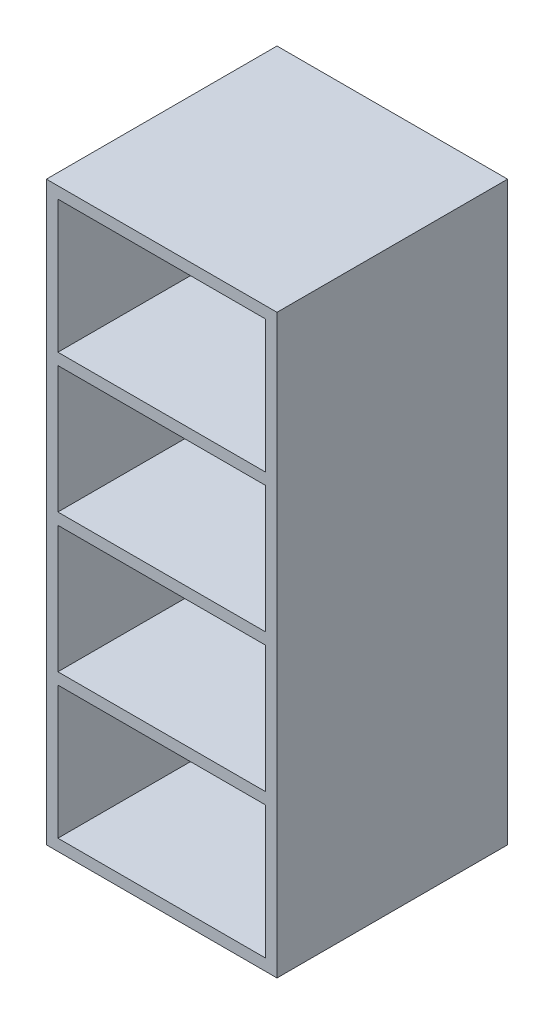
ISO-10303-21;
HEADER;
FILE_DESCRIPTION(('STEP AP214'),'2;1');
FILE_NAME('part.step','',(''),(''),'','','');
FILE_SCHEMA(('AUTOMOTIVE_DESIGN { 1 0 10303 214 1 1 1 1 }'));
ENDSEC;
DATA;
#1=APPLICATION_CONTEXT('core data for automotive mechanical design processes');
#2=APPLICATION_PROTOCOL_DEFINITION('international standard','automotive_design',2000,#1);
#3=PRODUCT_CONTEXT('',#1,'mechanical');
#4=PRODUCT('Part','Part','',(#3));
#5=PRODUCT_RELATED_PRODUCT_CATEGORY('part','',(#4));
#6=PRODUCT_DEFINITION_FORMATION('','',#4);
#7=PRODUCT_DEFINITION_CONTEXT('part definition',#1,'design');
#8=PRODUCT_DEFINITION('design','',#6,#7);
#9=PRODUCT_DEFINITION_SHAPE('','',#8);
#10=(LENGTH_UNIT() NAMED_UNIT(*) SI_UNIT(.MILLI.,.METRE.));
#11=(NAMED_UNIT(*) PLANE_ANGLE_UNIT() SI_UNIT($,.RADIAN.));
#12=(NAMED_UNIT(*) SI_UNIT($,.STERADIAN.) SOLID_ANGLE_UNIT());
#13=UNCERTAINTY_MEASURE_WITH_UNIT(LENGTH_MEASURE(1.E-05),#10,'distance_accuracy_value','');
#14=(GEOMETRIC_REPRESENTATION_CONTEXT(3) GLOBAL_UNCERTAINTY_ASSIGNED_CONTEXT((#13)) GLOBAL_UNIT_ASSIGNED_CONTEXT((#10,
#11,#12)) REPRESENTATION_CONTEXT('',''));
#15=CARTESIAN_POINT('',(0.,0.,0.));
#16=DIRECTION('',(0.,0.,1.));
#17=DIRECTION('',(1.,0.,0.));
#18=AXIS2_PLACEMENT_3D('',#15,#16,#17);
#19=CARTESIAN_POINT('',(-180.,0.,400.));
#20=DIRECTION('',(1.,0.,0.));
#21=DIRECTION('',(0.,0.,-1.));
#22=AXIS2_PLACEMENT_3D('',#19,#20,#21);
#23=PLANE('',#22);
#24=DIRECTION('',(0.,0.,-1.));
#25=VECTOR('',#24,1.);
#26=CARTESIAN_POINT('',(-180.,750.,400.));
#27=LINE('',#26,#25);
#28=CARTESIAN_POINT('',(-180.,750.,400.));
#29=VERTEX_POINT('',#28);
#30=CARTESIAN_POINT('',(-180.,750.,10.));
#31=VERTEX_POINT('',#30);
#32=EDGE_CURVE('E190',#29,#31,#27,.T.);
#33=ORIENTED_EDGE('',*,*,#32,.T.);
#34=DIRECTION('',(0.,1.,0.));
#35=VECTOR('',#34,1.);
#36=CARTESIAN_POINT('',(-180.,0.,10.));
#37=LINE('',#36,#35);
#38=CARTESIAN_POINT('',(-180.,980.,10.));
#39=VERTEX_POINT('',#38);
#40=EDGE_CURVE('E173',#31,#39,#37,.T.);
#41=ORIENTED_EDGE('',*,*,#40,.T.);
#42=DIRECTION('',(0.,0.,-1.));
#43=VECTOR('',#42,1.);
#44=CARTESIAN_POINT('',(-180.,980.,400.));
#45=LINE('',#44,#43);
#46=CARTESIAN_POINT('',(-180.,980.,400.));
#47=VERTEX_POINT('',#46);
#48=EDGE_CURVE('E41',#47,#39,#45,.T.);
#49=ORIENTED_EDGE('',*,*,#48,.F.);
#50=DIRECTION('',(0.,-1.,0.));
#51=VECTOR('',#50,1.);
#52=CARTESIAN_POINT('',(-180.,0.,400.));
#53=LINE('',#52,#51);
#54=EDGE_CURVE('E278',#47,#29,#53,.T.);
#55=ORIENTED_EDGE('',*,*,#54,.T.);
#56=EDGE_LOOP('',(#33,#41,#49,#55));
#57=FACE_BOUND('',#56,.T.);
#58=ADVANCED_FACE('F33',(#57),#23,.T.);
#59=CARTESIAN_POINT('',(0.,980.,400.));
#60=DIRECTION('',(0.,1.,0.));
#61=DIRECTION('',(0.,0.,1.));
#62=AXIS2_PLACEMENT_3D('',#59,#60,#61);
#63=PLANE('',#62);
#64=DIRECTION('',(-1.,0.,0.));
#65=VECTOR('',#64,1.);
#66=CARTESIAN_POINT('',(0.,980.,10.));
#67=LINE('',#66,#65);
#68=CARTESIAN_POINT('',(180.,980.,10.));
#69=VERTEX_POINT('',#68);
#70=EDGE_CURVE('E185',#69,#39,#67,.T.);
#71=ORIENTED_EDGE('',*,*,#70,.F.);
#72=DIRECTION('',(0.,0.,-1.));
#73=VECTOR('',#72,1.);
#74=CARTESIAN_POINT('',(180.,980.,400.));
#75=LINE('',#74,#73);
#76=CARTESIAN_POINT('',(180.,980.,400.));
#77=VERTEX_POINT('',#76);
#78=EDGE_CURVE('E184',#77,#69,#75,.T.);
#79=ORIENTED_EDGE('',*,*,#78,.F.);
#80=DIRECTION('',(1.,0.,0.));
#81=VECTOR('',#80,1.);
#82=CARTESIAN_POINT('',(0.,980.,400.));
#83=LINE('',#82,#81);
#84=EDGE_CURVE('E313',#47,#77,#83,.T.);
#85=ORIENTED_EDGE('',*,*,#84,.F.);
#86=ORIENTED_EDGE('',*,*,#48,.T.);
#87=EDGE_LOOP('',(#71,#79,#85,#86));
#88=FACE_BOUND('',#87,.T.);
#89=ADVANCED_FACE('F356',(#88),#63,.F.);
#90=CARTESIAN_POINT('',(180.,0.,400.));
#91=DIRECTION('',(1.,0.,0.));
#92=DIRECTION('',(0.,1.,0.));
#93=AXIS2_PLACEMENT_3D('',#90,#91,#92);
#94=PLANE('',#93);
#95=DIRECTION('',(0.,1.,0.));
#96=VECTOR('',#95,1.);
#97=CARTESIAN_POINT('',(180.,0.,10.));
#98=LINE('',#97,#96);
#99=CARTESIAN_POINT('',(180.,750.,10.));
#100=VERTEX_POINT('',#99);
#101=EDGE_CURVE('E170',#100,#69,#98,.T.);
#102=ORIENTED_EDGE('',*,*,#101,.F.);
#103=DIRECTION('',(0.,0.,-1.));
#104=VECTOR('',#103,1.);
#105=CARTESIAN_POINT('',(180.,750.,400.));
#106=LINE('',#105,#104);
#107=CARTESIAN_POINT('',(180.,750.,400.));
#108=VERTEX_POINT('',#107);
#109=EDGE_CURVE('E181',#108,#100,#106,.T.);
#110=ORIENTED_EDGE('',*,*,#109,.F.);
#111=DIRECTION('',(0.,-1.,0.));
#112=VECTOR('',#111,1.);
#113=CARTESIAN_POINT('',(180.,0.,400.));
#114=LINE('',#113,#112);
#115=EDGE_CURVE('E284',#77,#108,#114,.T.);
#116=ORIENTED_EDGE('',*,*,#115,.F.);
#117=ORIENTED_EDGE('',*,*,#78,.T.);
#118=EDGE_LOOP('',(#102,#110,#116,#117));
#119=FACE_BOUND('',#118,.T.);
#120=ADVANCED_FACE('F180',(#119),#94,.F.);
#121=DIRECTION('',(0.,0.,-1.));
#122=VECTOR('',#121,1.);
#123=CARTESIAN_POINT('',(-180.,20.,400.));
#124=LINE('',#123,#122);
#125=CARTESIAN_POINT('',(-180.,20.,400.));
#126=VERTEX_POINT('',#125);
#127=CARTESIAN_POINT('',(-180.,20.,10.));
#128=VERTEX_POINT('',#127);
#129=EDGE_CURVE('E207',#126,#128,#124,.T.);
#130=ORIENTED_EDGE('',*,*,#129,.T.);
#131=DIRECTION('',(0.,1.,0.));
#132=VECTOR('',#131,1.);
#133=CARTESIAN_POINT('',(-180.,0.,10.));
#134=LINE('',#133,#132);
#135=CARTESIAN_POINT('',(-180.,250.,10.));
#136=VERTEX_POINT('',#135);
#137=EDGE_CURVE('E48',#128,#136,#134,.T.);
#138=ORIENTED_EDGE('',*,*,#137,.T.);
#139=DIRECTION('',(0.,0.,-1.));
#140=VECTOR('',#139,1.);
#141=CARTESIAN_POINT('',(-180.,250.,400.));
#142=LINE('',#141,#140);
#143=CARTESIAN_POINT('',(-180.,250.,400.));
#144=VERTEX_POINT('',#143);
#145=EDGE_CURVE('E202',#144,#136,#142,.T.);
#146=ORIENTED_EDGE('',*,*,#145,.F.);
#147=EDGE_CURVE('E294',#144,#126,#53,.T.);
#148=ORIENTED_EDGE('',*,*,#147,.T.);
#149=EDGE_LOOP('',(#130,#138,#146,#148));
#150=FACE_BOUND('',#149,.T.);
#151=ADVANCED_FACE('F359',(#150),#23,.T.);
#152=CARTESIAN_POINT('',(0.,250.,400.));
#153=DIRECTION('',(0.,1.,0.));
#154=DIRECTION('',(0.,0.,1.));
#155=AXIS2_PLACEMENT_3D('',#152,#153,#154);
#156=PLANE('',#155);
#157=DIRECTION('',(-1.,0.,0.));
#158=VECTOR('',#157,1.);
#159=CARTESIAN_POINT('',(0.,250.,10.));
#160=LINE('',#159,#158);
#161=CARTESIAN_POINT('',(180.,250.,10.));
#162=VERTEX_POINT('',#161);
#163=EDGE_CURVE('E272',#162,#136,#160,.T.);
#164=ORIENTED_EDGE('',*,*,#163,.F.);
#165=DIRECTION('',(0.,0.,-1.));
#166=VECTOR('',#165,1.);
#167=CARTESIAN_POINT('',(180.,250.,400.));
#168=LINE('',#167,#166);
#169=CARTESIAN_POINT('',(180.,250.,400.));
#170=VERTEX_POINT('',#169);
#171=EDGE_CURVE('E214',#170,#162,#168,.T.);
#172=ORIENTED_EDGE('',*,*,#171,.F.);
#173=DIRECTION('',(1.,0.,0.));
#174=VECTOR('',#173,1.);
#175=CARTESIAN_POINT('',(0.,250.,400.));
#176=LINE('',#175,#174);
#177=EDGE_CURVE('E295',#144,#170,#176,.T.);
#178=ORIENTED_EDGE('',*,*,#177,.F.);
#179=ORIENTED_EDGE('',*,*,#145,.T.);
#180=EDGE_LOOP('',(#164,#172,#178,#179));
#181=FACE_BOUND('',#180,.T.);
#182=ADVANCED_FACE('F366',(#181),#156,.F.);
#183=DIRECTION('',(0.,1.,0.));
#184=VECTOR('',#183,1.);
#185=CARTESIAN_POINT('',(180.,0.,10.));
#186=LINE('',#185,#184);
#187=CARTESIAN_POINT('',(180.,20.,10.));
#188=VERTEX_POINT('',#187);
#189=EDGE_CURVE('E270',#188,#162,#186,.T.);
#190=ORIENTED_EDGE('',*,*,#189,.F.);
#191=DIRECTION('',(0.,0.,-1.));
#192=VECTOR('',#191,1.);
#193=CARTESIAN_POINT('',(180.,20.,400.));
#194=LINE('',#193,#192);
#195=CARTESIAN_POINT('',(180.,20.,400.));
#196=VERTEX_POINT('',#195);
#197=EDGE_CURVE('E210',#196,#188,#194,.T.);
#198=ORIENTED_EDGE('',*,*,#197,.F.);
#199=EDGE_CURVE('E298',#170,#196,#114,.T.);
#200=ORIENTED_EDGE('',*,*,#199,.F.);
#201=ORIENTED_EDGE('',*,*,#171,.T.);
#202=EDGE_LOOP('',(#190,#198,#200,#201));
#203=FACE_BOUND('',#202,.T.);
#204=ADVANCED_FACE('F379',(#203),#94,.F.);
#205=DIRECTION('',(0.,0.,-1.));
#206=VECTOR('',#205,1.);
#207=CARTESIAN_POINT('',(-180.,270.,400.));
#208=LINE('',#207,#206);
#209=CARTESIAN_POINT('',(-180.,270.,400.));
#210=VERTEX_POINT('',#209);
#211=CARTESIAN_POINT('',(-180.,270.,10.));
#212=VERTEX_POINT('',#211);
#213=EDGE_CURVE('E219',#210,#212,#208,.T.);
#214=ORIENTED_EDGE('',*,*,#213,.T.);
#215=DIRECTION('',(0.,1.,0.));
#216=VECTOR('',#215,1.);
#217=CARTESIAN_POINT('',(-180.,0.,10.));
#218=LINE('',#217,#216);
#219=CARTESIAN_POINT('',(-180.,490.,10.));
#220=VERTEX_POINT('',#219);
#221=EDGE_CURVE('E56',#212,#220,#218,.T.);
#222=ORIENTED_EDGE('',*,*,#221,.T.);
#223=DIRECTION('',(0.,0.,-1.));
#224=VECTOR('',#223,1.);
#225=CARTESIAN_POINT('',(-180.,490.,400.));
#226=LINE('',#225,#224);
#227=CARTESIAN_POINT('',(-180.,490.,400.));
#228=VERTEX_POINT('',#227);
#229=EDGE_CURVE('E211',#228,#220,#226,.T.);
#230=ORIENTED_EDGE('',*,*,#229,.F.);
#231=EDGE_CURVE('E279',#228,#210,#53,.T.);
#232=ORIENTED_EDGE('',*,*,#231,.T.);
#233=EDGE_LOOP('',(#214,#222,#230,#232));
#234=FACE_BOUND('',#233,.T.);
#235=ADVANCED_FACE('F368',(#234),#23,.T.);
#236=CARTESIAN_POINT('',(0.,490.,400.));
#237=DIRECTION('',(0.,1.,0.));
#238=DIRECTION('',(0.,0.,1.));
#239=AXIS2_PLACEMENT_3D('',#236,#237,#238);
#240=PLANE('',#239);
#241=DIRECTION('',(-1.,0.,0.));
#242=VECTOR('',#241,1.);
#243=CARTESIAN_POINT('',(0.,490.,10.));
#244=LINE('',#243,#242);
#245=CARTESIAN_POINT('',(180.,490.,10.));
#246=VERTEX_POINT('',#245);
#247=EDGE_CURVE('E265',#246,#220,#244,.T.);
#248=ORIENTED_EDGE('',*,*,#247,.F.);
#249=DIRECTION('',(0.,0.,-1.));
#250=VECTOR('',#249,1.);
#251=CARTESIAN_POINT('',(180.,490.,400.));
#252=LINE('',#251,#250);
#253=CARTESIAN_POINT('',(180.,490.,400.));
#254=VERTEX_POINT('',#253);
#255=EDGE_CURVE('E226',#254,#246,#252,.T.);
#256=ORIENTED_EDGE('',*,*,#255,.F.);
#257=DIRECTION('',(1.,0.,0.));
#258=VECTOR('',#257,1.);
#259=CARTESIAN_POINT('',(0.,490.,400.));
#260=LINE('',#259,#258);
#261=EDGE_CURVE('E288',#228,#254,#260,.T.);
#262=ORIENTED_EDGE('',*,*,#261,.F.);
#263=ORIENTED_EDGE('',*,*,#229,.T.);
#264=EDGE_LOOP('',(#248,#256,#262,#263));
#265=FACE_BOUND('',#264,.T.);
#266=ADVANCED_FACE('F376',(#265),#240,.F.);
#267=DIRECTION('',(0.,1.,0.));
#268=VECTOR('',#267,1.);
#269=CARTESIAN_POINT('',(180.,0.,10.));
#270=LINE('',#269,#268);
#271=CARTESIAN_POINT('',(180.,270.,10.));
#272=VERTEX_POINT('',#271);
#273=EDGE_CURVE('E258',#272,#246,#270,.T.);
#274=ORIENTED_EDGE('',*,*,#273,.F.);
#275=DIRECTION('',(0.,0.,-1.));
#276=VECTOR('',#275,1.);
#277=CARTESIAN_POINT('',(180.,270.,400.));
#278=LINE('',#277,#276);
#279=CARTESIAN_POINT('',(180.,270.,400.));
#280=VERTEX_POINT('',#279);
#281=EDGE_CURVE('E222',#280,#272,#278,.T.);
#282=ORIENTED_EDGE('',*,*,#281,.F.);
#283=EDGE_CURVE('E285',#254,#280,#114,.T.);
#284=ORIENTED_EDGE('',*,*,#283,.F.);
#285=ORIENTED_EDGE('',*,*,#255,.T.);
#286=EDGE_LOOP('',(#274,#282,#284,#285));
#287=FACE_BOUND('',#286,.T.);
#288=ADVANCED_FACE('F370',(#287),#94,.F.);
#289=DIRECTION('',(0.,0.,-1.));
#290=VECTOR('',#289,1.);
#291=CARTESIAN_POINT('',(-180.,510.,400.));
#292=LINE('',#291,#290);
#293=CARTESIAN_POINT('',(-180.,510.,400.));
#294=VERTEX_POINT('',#293);
#295=CARTESIAN_POINT('',(-180.,510.,10.));
#296=VERTEX_POINT('',#295);
#297=EDGE_CURVE('E231',#294,#296,#292,.T.);
#298=ORIENTED_EDGE('',*,*,#297,.T.);
#299=DIRECTION('',(0.,1.,0.));
#300=VECTOR('',#299,1.);
#301=CARTESIAN_POINT('',(-180.,0.,10.));
#302=LINE('',#301,#300);
#303=CARTESIAN_POINT('',(-180.,730.,10.));
#304=VERTEX_POINT('',#303);
#305=EDGE_CURVE('E253',#296,#304,#302,.T.);
#306=ORIENTED_EDGE('',*,*,#305,.T.);
#307=DIRECTION('',(0.,0.,-1.));
#308=VECTOR('',#307,1.);
#309=CARTESIAN_POINT('',(-180.,730.,400.));
#310=LINE('',#309,#308);
#311=CARTESIAN_POINT('',(-180.,730.,400.));
#312=VERTEX_POINT('',#311);
#313=EDGE_CURVE('E223',#312,#304,#310,.T.);
#314=ORIENTED_EDGE('',*,*,#313,.F.);
#315=EDGE_CURVE('E251',#312,#294,#53,.T.);
#316=ORIENTED_EDGE('',*,*,#315,.T.);
#317=EDGE_LOOP('',(#298,#306,#314,#316));
#318=FACE_BOUND('',#317,.T.);
#319=ADVANCED_FACE('F250',(#318),#23,.T.);
#320=CARTESIAN_POINT('',(0.,730.,400.));
#321=DIRECTION('',(0.,1.,0.));
#322=DIRECTION('',(0.,0.,1.));
#323=AXIS2_PLACEMENT_3D('',#320,#321,#322);
#324=PLANE('',#323);
#325=DIRECTION('',(-1.,0.,0.));
#326=VECTOR('',#325,1.);
#327=CARTESIAN_POINT('',(0.,730.,10.));
#328=LINE('',#327,#326);
#329=CARTESIAN_POINT('',(180.,730.,10.));
#330=VERTEX_POINT('',#329);
#331=EDGE_CURVE('E244',#330,#304,#328,.T.);
#332=ORIENTED_EDGE('',*,*,#331,.F.);
#333=DIRECTION('',(0.,0.,-1.));
#334=VECTOR('',#333,1.);
#335=CARTESIAN_POINT('',(180.,730.,400.));
#336=LINE('',#335,#334);
#337=CARTESIAN_POINT('',(180.,730.,400.));
#338=VERTEX_POINT('',#337);
#339=EDGE_CURVE('E237',#338,#330,#336,.T.);
#340=ORIENTED_EDGE('',*,*,#339,.F.);
#341=DIRECTION('',(1.,0.,0.));
#342=VECTOR('',#341,1.);
#343=CARTESIAN_POINT('',(0.,730.,400.));
#344=LINE('',#343,#342);
#345=EDGE_CURVE('E245',#312,#338,#344,.T.);
#346=ORIENTED_EDGE('',*,*,#345,.F.);
#347=ORIENTED_EDGE('',*,*,#313,.T.);
#348=EDGE_LOOP('',(#332,#340,#346,#347));
#349=FACE_BOUND('',#348,.T.);
#350=ADVANCED_FACE('F35',(#349),#324,.F.);
#351=DIRECTION('',(0.,1.,0.));
#352=VECTOR('',#351,1.);
#353=CARTESIAN_POINT('',(180.,0.,10.));
#354=LINE('',#353,#352);
#355=CARTESIAN_POINT('',(180.,510.,10.));
#356=VERTEX_POINT('',#355);
#357=EDGE_CURVE('E260',#356,#330,#354,.T.);
#358=ORIENTED_EDGE('',*,*,#357,.F.);
#359=DIRECTION('',(0.,0.,-1.));
#360=VECTOR('',#359,1.);
#361=CARTESIAN_POINT('',(180.,510.,400.));
#362=LINE('',#361,#360);
#363=CARTESIAN_POINT('',(180.,510.,400.));
#364=VERTEX_POINT('',#363);
#365=EDGE_CURVE('E234',#364,#356,#362,.T.);
#366=ORIENTED_EDGE('',*,*,#365,.F.);
#367=EDGE_CURVE('E281',#338,#364,#114,.T.);
#368=ORIENTED_EDGE('',*,*,#367,.F.);
#369=ORIENTED_EDGE('',*,*,#339,.T.);
#370=EDGE_LOOP('',(#358,#366,#368,#369));
#371=FACE_BOUND('',#370,.T.);
#372=ADVANCED_FACE('F375',(#371),#94,.F.);
#373=CARTESIAN_POINT('',(0.,20.,400.));
#374=DIRECTION('',(0.,1.,0.));
#375=DIRECTION('',(-1.,0.,0.));
#376=AXIS2_PLACEMENT_3D('',#373,#374,#375);
#377=PLANE('',#376);
#378=ORIENTED_EDGE('',*,*,#197,.T.);
#379=DIRECTION('',(-1.,0.,0.));
#380=VECTOR('',#379,1.);
#381=CARTESIAN_POINT('',(0.,20.,10.));
#382=LINE('',#381,#380);
#383=EDGE_CURVE('E268',#188,#128,#382,.T.);
#384=ORIENTED_EDGE('',*,*,#383,.T.);
#385=ORIENTED_EDGE('',*,*,#129,.F.);
#386=DIRECTION('',(1.,0.,0.));
#387=VECTOR('',#386,1.);
#388=CARTESIAN_POINT('',(0.,20.,400.));
#389=LINE('',#388,#387);
#390=EDGE_CURVE('E299',#126,#196,#389,.T.);
#391=ORIENTED_EDGE('',*,*,#390,.T.);
#392=EDGE_LOOP('',(#378,#384,#385,#391));
#393=FACE_BOUND('',#392,.T.);
#394=ADVANCED_FACE('F413',(#393),#377,.T.);
#395=CARTESIAN_POINT('',(0.,270.,400.));
#396=DIRECTION('',(0.,1.,0.));
#397=DIRECTION('',(0.,0.,1.));
#398=AXIS2_PLACEMENT_3D('',#395,#396,#397);
#399=PLANE('',#398);
#400=ORIENTED_EDGE('',*,*,#281,.T.);
#401=DIRECTION('',(-1.,0.,0.));
#402=VECTOR('',#401,1.);
#403=CARTESIAN_POINT('',(0.,270.,10.));
#404=LINE('',#403,#402);
#405=EDGE_CURVE('E256',#272,#212,#404,.T.);
#406=ORIENTED_EDGE('',*,*,#405,.T.);
#407=ORIENTED_EDGE('',*,*,#213,.F.);
#408=DIRECTION('',(1.,0.,0.));
#409=VECTOR('',#408,1.);
#410=CARTESIAN_POINT('',(0.,270.,400.));
#411=LINE('',#410,#409);
#412=EDGE_CURVE('E291',#210,#280,#411,.T.);
#413=ORIENTED_EDGE('',*,*,#412,.T.);
#414=EDGE_LOOP('',(#400,#406,#407,#413));
#415=FACE_BOUND('',#414,.T.);
#416=ADVANCED_FACE('F393',(#415),#399,.T.);
#417=CARTESIAN_POINT('',(0.,510.,400.));
#418=DIRECTION('',(0.,1.,0.));
#419=DIRECTION('',(0.,0.,1.));
#420=AXIS2_PLACEMENT_3D('',#417,#418,#419);
#421=PLANE('',#420);
#422=ORIENTED_EDGE('',*,*,#365,.T.);
#423=DIRECTION('',(-1.,0.,0.));
#424=VECTOR('',#423,1.);
#425=CARTESIAN_POINT('',(0.,510.,10.));
#426=LINE('',#425,#424);
#427=EDGE_CURVE('E449',#356,#296,#426,.T.);
#428=ORIENTED_EDGE('',*,*,#427,.T.);
#429=ORIENTED_EDGE('',*,*,#297,.F.);
#430=DIRECTION('',(1.,0.,0.));
#431=VECTOR('',#430,1.);
#432=CARTESIAN_POINT('',(0.,510.,400.));
#433=LINE('',#432,#431);
#434=EDGE_CURVE('E283',#294,#364,#433,.T.);
#435=ORIENTED_EDGE('',*,*,#434,.T.);
#436=EDGE_LOOP('',(#422,#428,#429,#435));
#437=FACE_BOUND('',#436,.T.);
#438=ADVANCED_FACE('F436',(#437),#421,.T.);
#439=CARTESIAN_POINT('',(0.,750.,400.));
#440=DIRECTION('',(0.,1.,0.));
#441=DIRECTION('',(0.,0.,1.));
#442=AXIS2_PLACEMENT_3D('',#439,#440,#441);
#443=PLANE('',#442);
#444=ORIENTED_EDGE('',*,*,#109,.T.);
#445=DIRECTION('',(-1.,0.,0.));
#446=VECTOR('',#445,1.);
#447=CARTESIAN_POINT('',(0.,750.,10.));
#448=LINE('',#447,#446);
#449=EDGE_CURVE('E11',#100,#31,#448,.T.);
#450=ORIENTED_EDGE('',*,*,#449,.T.);
#451=ORIENTED_EDGE('',*,*,#32,.F.);
#452=DIRECTION('',(1.,0.,0.));
#453=VECTOR('',#452,1.);
#454=CARTESIAN_POINT('',(0.,750.,400.));
#455=LINE('',#454,#453);
#456=EDGE_CURVE('E189',#29,#108,#455,.T.);
#457=ORIENTED_EDGE('',*,*,#456,.T.);
#458=EDGE_LOOP('',(#444,#450,#451,#457));
#459=FACE_BOUND('',#458,.T.);
#460=ADVANCED_FACE('F187',(#459),#443,.T.);
#461=CARTESIAN_POINT('',(200.,0.,400.));
#462=DIRECTION('',(1.,0.,0.));
#463=DIRECTION('',(0.,1.,0.));
#464=AXIS2_PLACEMENT_3D('',#461,#462,#463);
#465=PLANE('',#464);
#466=DIRECTION('',(0.,-1.,0.));
#467=VECTOR('',#466,1.);
#468=CARTESIAN_POINT('',(200.,0.,0.));
#469=LINE('',#468,#467);
#470=CARTESIAN_POINT('',(200.,1000.,0.));
#471=VERTEX_POINT('',#470);
#472=CARTESIAN_POINT('',(200.,0.,0.));
#473=VERTEX_POINT('',#472);
#474=EDGE_CURVE('E275',#471,#473,#469,.T.);
#475=ORIENTED_EDGE('',*,*,#474,.F.);
#476=DIRECTION('',(0.,0.,-1.));
#477=VECTOR('',#476,1.);
#478=CARTESIAN_POINT('',(200.,1000.,400.));
#479=LINE('',#478,#477);
#480=CARTESIAN_POINT('',(200.,1000.,400.));
#481=VERTEX_POINT('',#480);
#482=EDGE_CURVE('E193',#481,#471,#479,.T.);
#483=ORIENTED_EDGE('',*,*,#482,.F.);
#484=DIRECTION('',(0.,-1.,0.));
#485=VECTOR('',#484,1.);
#486=CARTESIAN_POINT('',(200.,0.,400.));
#487=LINE('',#486,#485);
#488=CARTESIAN_POINT('',(200.,0.,400.));
#489=VERTEX_POINT('',#488);
#490=EDGE_CURVE('E302',#481,#489,#487,.T.);
#491=ORIENTED_EDGE('',*,*,#490,.T.);
#492=DIRECTION('',(0.,0.,-1.));
#493=VECTOR('',#492,1.);
#494=CARTESIAN_POINT('',(200.,0.,400.));
#495=LINE('',#494,#493);
#496=EDGE_CURVE('E199',#489,#473,#495,.T.);
#497=ORIENTED_EDGE('',*,*,#496,.T.);
#498=EDGE_LOOP('',(#475,#483,#491,#497));
#499=FACE_BOUND('',#498,.T.);
#500=ADVANCED_FACE('F336',(#499),#465,.T.);
#501=CARTESIAN_POINT('',(0.,1000.,400.));
#502=DIRECTION('',(0.,1.,0.));
#503=DIRECTION('',(0.,0.,1.));
#504=AXIS2_PLACEMENT_3D('',#501,#502,#503);
#505=PLANE('',#504);
#506=DIRECTION('',(1.,0.,0.));
#507=VECTOR('',#506,1.);
#508=CARTESIAN_POINT('',(0.,1000.,0.));
#509=LINE('',#508,#507);
#510=CARTESIAN_POINT('',(-200.,1000.,0.));
#511=VERTEX_POINT('',#510);
#512=EDGE_CURVE('E319',#511,#471,#509,.T.);
#513=ORIENTED_EDGE('',*,*,#512,.F.);
#514=DIRECTION('',(0.,0.,-1.));
#515=VECTOR('',#514,1.);
#516=CARTESIAN_POINT('',(-200.,1000.,400.));
#517=LINE('',#516,#515);
#518=CARTESIAN_POINT('',(-200.,1000.,400.));
#519=VERTEX_POINT('',#518);
#520=EDGE_CURVE('E204',#519,#511,#517,.T.);
#521=ORIENTED_EDGE('',*,*,#520,.F.);
#522=DIRECTION('',(1.,0.,0.));
#523=VECTOR('',#522,1.);
#524=CARTESIAN_POINT('',(0.,1000.,400.));
#525=LINE('',#524,#523);
#526=EDGE_CURVE('E305',#519,#481,#525,.T.);
#527=ORIENTED_EDGE('',*,*,#526,.T.);
#528=ORIENTED_EDGE('',*,*,#482,.T.);
#529=EDGE_LOOP('',(#513,#521,#527,#528));
#530=FACE_BOUND('',#529,.T.);
#531=ADVANCED_FACE('F343',(#530),#505,.T.);
#532=CARTESIAN_POINT('',(-200.,0.,400.));
#533=DIRECTION('',(1.,0.,0.));
#534=DIRECTION('',(0.,1.,0.));
#535=AXIS2_PLACEMENT_3D('',#532,#533,#534);
#536=PLANE('',#535);
#537=DIRECTION('',(0.,-1.,0.));
#538=VECTOR('',#537,1.);
#539=CARTESIAN_POINT('',(-200.,0.,0.));
#540=LINE('',#539,#538);
#541=CARTESIAN_POINT('',(-200.,0.,0.));
#542=VERTEX_POINT('',#541);
#543=EDGE_CURVE('E322',#511,#542,#540,.T.);
#544=ORIENTED_EDGE('',*,*,#543,.T.);
#545=DIRECTION('',(0.,0.,-1.));
#546=VECTOR('',#545,1.);
#547=CARTESIAN_POINT('',(-200.,0.,400.));
#548=LINE('',#547,#546);
#549=CARTESIAN_POINT('',(-200.,0.,400.));
#550=VERTEX_POINT('',#549);
#551=EDGE_CURVE('E201',#550,#542,#548,.T.);
#552=ORIENTED_EDGE('',*,*,#551,.F.);
#553=DIRECTION('',(0.,-1.,0.));
#554=VECTOR('',#553,1.);
#555=CARTESIAN_POINT('',(-200.,0.,400.));
#556=LINE('',#555,#554);
#557=EDGE_CURVE('E308',#519,#550,#556,.T.);
#558=ORIENTED_EDGE('',*,*,#557,.F.);
#559=ORIENTED_EDGE('',*,*,#520,.T.);
#560=EDGE_LOOP('',(#544,#552,#558,#559));
#561=FACE_BOUND('',#560,.T.);
#562=ADVANCED_FACE('F346',(#561),#536,.F.);
#563=CARTESIAN_POINT('',(0.,0.,400.));
#564=DIRECTION('',(0.,1.,0.));
#565=DIRECTION('',(0.,0.,1.));
#566=AXIS2_PLACEMENT_3D('',#563,#564,#565);
#567=PLANE('',#566);
#568=DIRECTION('',(1.,0.,0.));
#569=VECTOR('',#568,1.);
#570=CARTESIAN_POINT('',(0.,0.,0.));
#571=LINE('',#570,#569);
#572=EDGE_CURVE('E277',#542,#473,#571,.T.);
#573=ORIENTED_EDGE('',*,*,#572,.T.);
#574=ORIENTED_EDGE('',*,*,#496,.F.);
#575=DIRECTION('',(1.,0.,0.));
#576=VECTOR('',#575,1.);
#577=CARTESIAN_POINT('',(0.,0.,400.));
#578=LINE('',#577,#576);
#579=EDGE_CURVE('E311',#550,#489,#578,.T.);
#580=ORIENTED_EDGE('',*,*,#579,.F.);
#581=ORIENTED_EDGE('',*,*,#551,.T.);
#582=EDGE_LOOP('',(#573,#574,#580,#581));
#583=FACE_BOUND('',#582,.T.);
#584=ADVANCED_FACE('F328',(#583),#567,.F.);
#585=CARTESIAN_POINT('',(0.,0.,400.));
#586=DIRECTION('',(0.,0.,1.));
#587=DIRECTION('',(1.,0.,0.));
#588=AXIS2_PLACEMENT_3D('',#585,#586,#587);
#589=PLANE('',#588);
#590=ORIENTED_EDGE('',*,*,#315,.F.);
#591=ORIENTED_EDGE('',*,*,#345,.T.);
#592=ORIENTED_EDGE('',*,*,#367,.T.);
#593=ORIENTED_EDGE('',*,*,#434,.F.);
#594=EDGE_LOOP('',(#590,#591,#592,#593));
#595=FACE_BOUND('',#594,.T.);
#596=ORIENTED_EDGE('',*,*,#231,.F.);
#597=ORIENTED_EDGE('',*,*,#261,.T.);
#598=ORIENTED_EDGE('',*,*,#283,.T.);
#599=ORIENTED_EDGE('',*,*,#412,.F.);
#600=EDGE_LOOP('',(#596,#597,#598,#599));
#601=FACE_BOUND('',#600,.T.);
#602=ORIENTED_EDGE('',*,*,#147,.F.);
#603=ORIENTED_EDGE('',*,*,#177,.T.);
#604=ORIENTED_EDGE('',*,*,#199,.T.);
#605=ORIENTED_EDGE('',*,*,#390,.F.);
#606=EDGE_LOOP('',(#602,#603,#604,#605));
#607=FACE_BOUND('',#606,.T.);
#608=ORIENTED_EDGE('',*,*,#490,.F.);
#609=ORIENTED_EDGE('',*,*,#526,.F.);
#610=ORIENTED_EDGE('',*,*,#557,.T.);
#611=ORIENTED_EDGE('',*,*,#579,.T.);
#612=EDGE_LOOP('',(#608,#609,#610,#611));
#613=FACE_BOUND('',#612,.T.);
#614=ORIENTED_EDGE('',*,*,#54,.F.);
#615=ORIENTED_EDGE('',*,*,#84,.T.);
#616=ORIENTED_EDGE('',*,*,#115,.T.);
#617=ORIENTED_EDGE('',*,*,#456,.F.);
#618=EDGE_LOOP('',(#614,#615,#616,#617));
#619=FACE_BOUND('',#618,.T.);
#620=ADVANCED_FACE('F340',(#595,#601,#607,#613,#619),#589,.T.);
#621=CARTESIAN_POINT('',(0.,0.,0.));
#622=DIRECTION('',(0.,0.,1.));
#623=DIRECTION('',(1.,0.,0.));
#624=AXIS2_PLACEMENT_3D('',#621,#622,#623);
#625=PLANE('',#624);
#626=ORIENTED_EDGE('',*,*,#474,.T.);
#627=ORIENTED_EDGE('',*,*,#572,.F.);
#628=ORIENTED_EDGE('',*,*,#543,.F.);
#629=ORIENTED_EDGE('',*,*,#512,.T.);
#630=EDGE_LOOP('',(#626,#627,#628,#629));
#631=FACE_BOUND('',#630,.T.);
#632=ADVANCED_FACE('F333',(#631),#625,.F.);
#633=CARTESIAN_POINT('',(0.,0.,10.));
#634=DIRECTION('',(0.,0.,-1.));
#635=DIRECTION('',(-1.,0.,0.));
#636=AXIS2_PLACEMENT_3D('',#633,#634,#635);
#637=PLANE('',#636);
#638=ORIENTED_EDGE('',*,*,#40,.F.);
#639=ORIENTED_EDGE('',*,*,#449,.F.);
#640=ORIENTED_EDGE('',*,*,#101,.T.);
#641=ORIENTED_EDGE('',*,*,#70,.T.);
#642=EDGE_LOOP('',(#638,#639,#640,#641));
#643=FACE_BOUND('',#642,.T.);
#644=ADVANCED_FACE('F169',(#643),#637,.F.);
#645=ORIENTED_EDGE('',*,*,#305,.F.);
#646=ORIENTED_EDGE('',*,*,#427,.F.);
#647=ORIENTED_EDGE('',*,*,#357,.T.);
#648=ORIENTED_EDGE('',*,*,#331,.T.);
#649=EDGE_LOOP('',(#645,#646,#647,#648));
#650=FACE_BOUND('',#649,.T.);
#651=ADVANCED_FACE('F422',(#650),#637,.F.);
#652=ORIENTED_EDGE('',*,*,#221,.F.);
#653=ORIENTED_EDGE('',*,*,#405,.F.);
#654=ORIENTED_EDGE('',*,*,#273,.T.);
#655=ORIENTED_EDGE('',*,*,#247,.T.);
#656=EDGE_LOOP('',(#652,#653,#654,#655));
#657=FACE_BOUND('',#656,.T.);
#658=ADVANCED_FACE('F396',(#657),#637,.F.);
#659=ORIENTED_EDGE('',*,*,#137,.F.);
#660=ORIENTED_EDGE('',*,*,#383,.F.);
#661=ORIENTED_EDGE('',*,*,#189,.T.);
#662=ORIENTED_EDGE('',*,*,#163,.T.);
#663=EDGE_LOOP('',(#659,#660,#661,#662));
#664=FACE_BOUND('',#663,.T.);
#665=ADVANCED_FACE('F416',(#664),#637,.F.);
#666=CLOSED_SHELL('',(#58,#89,#120,#151,#182,#204,#235,#266,#288,#319,#350,#372,#394,#416,#438,
#460,#500,#531,#562,#584,#620,#632,#644,#651,#658,#665));
#667=MANIFOLD_SOLID_BREP('B2',#666);
#668=ADVANCED_BREP_SHAPE_REPRESENTATION('',(#18,#667),#14);
#669=SHAPE_DEFINITION_REPRESENTATION(#9,#668);
ENDSEC;
END-ISO-10303-21;
